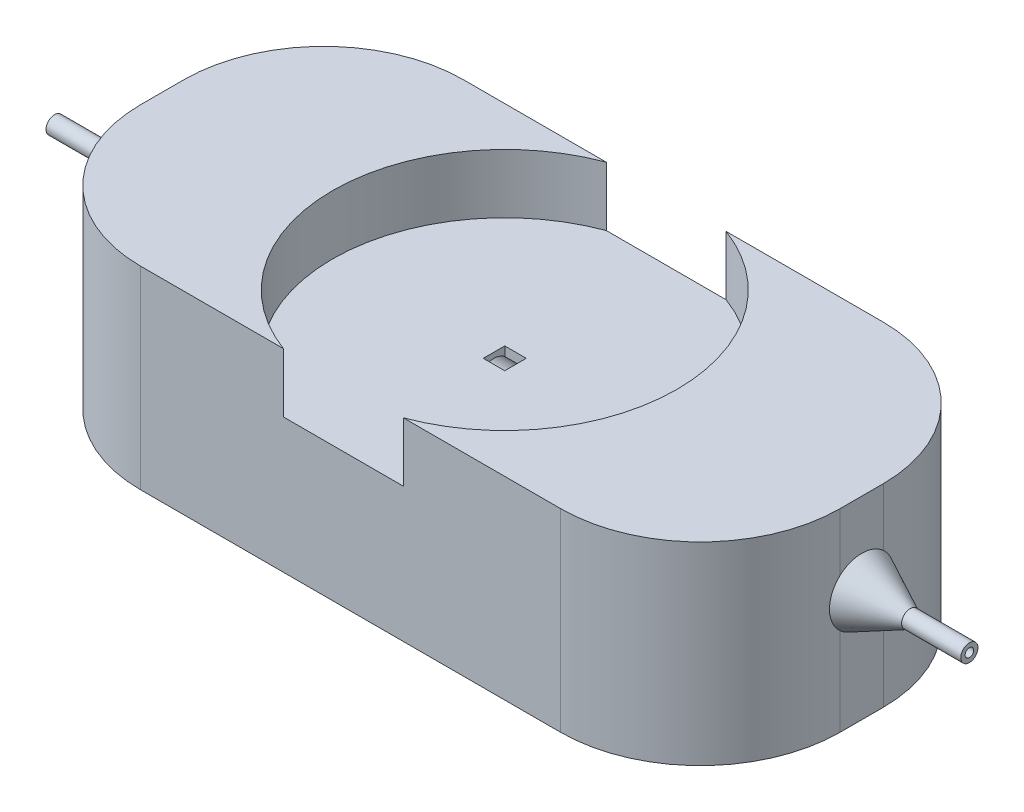
ISO-10303-21;
HEADER;
FILE_DESCRIPTION(('STEP AP214'),'2;1');
FILE_NAME('part.step','',(''),(''),'','','');
FILE_SCHEMA(('AUTOMOTIVE_DESIGN { 1 0 10303 214 1 1 1 1 }'));
ENDSEC;
DATA;
#1=APPLICATION_CONTEXT('core data for automotive mechanical design processes');
#2=APPLICATION_PROTOCOL_DEFINITION('international standard','automotive_design',2000,#1);
#3=PRODUCT_CONTEXT('',#1,'mechanical');
#4=PRODUCT('Part','Part','',(#3));
#5=PRODUCT_RELATED_PRODUCT_CATEGORY('part','',(#4));
#6=PRODUCT_DEFINITION_FORMATION('','',#4);
#7=PRODUCT_DEFINITION_CONTEXT('part definition',#1,'design');
#8=PRODUCT_DEFINITION('design','',#6,#7);
#9=PRODUCT_DEFINITION_SHAPE('','',#8);
#10=(LENGTH_UNIT() NAMED_UNIT(*) SI_UNIT(.MILLI.,.METRE.));
#11=(NAMED_UNIT(*) PLANE_ANGLE_UNIT() SI_UNIT($,.RADIAN.));
#12=(NAMED_UNIT(*) SI_UNIT($,.STERADIAN.) SOLID_ANGLE_UNIT());
#13=UNCERTAINTY_MEASURE_WITH_UNIT(LENGTH_MEASURE(1.E-05),#10,'distance_accuracy_value','');
#14=(GEOMETRIC_REPRESENTATION_CONTEXT(3) GLOBAL_UNCERTAINTY_ASSIGNED_CONTEXT((#13)) GLOBAL_UNIT_ASSIGNED_CONTEXT((#10,
#11,#12)) REPRESENTATION_CONTEXT('',''));
#15=CARTESIAN_POINT('',(0.,0.,0.));
#16=DIRECTION('',(0.,0.,1.));
#17=DIRECTION('',(1.,0.,0.));
#18=AXIS2_PLACEMENT_3D('',#15,#16,#17);
#19=CARTESIAN_POINT('',(40.,58.,15.));
#20=DIRECTION('',(-1.,0.,0.));
#21=DIRECTION('',(0.,0.,1.));
#22=AXIS2_PLACEMENT_3D('',#19,#20,#21);
#23=PLANE('',#22);
#24=DIRECTION('',(0.,-1.,0.));
#25=VECTOR('',#24,1.);
#26=CARTESIAN_POINT('',(40.,58.,2.00000000000001));
#27=LINE('',#26,#25);
#28=CARTESIAN_POINT('',(40.,58.,2.00000000000001));
#29=VERTEX_POINT('',#28);
#30=CARTESIAN_POINT('',(40.,52.6346340871573,2.00000000000001));
#31=VERTEX_POINT('',#30);
#32=EDGE_CURVE('E224',#29,#31,#27,.T.);
#33=ORIENTED_EDGE('',*,*,#32,.T.);
#34=CARTESIAN_POINT('',(40.,50.3985661096575,0.));
#35=DIRECTION('',(1.,0.,0.));
#36=DIRECTION('',(0.,0.,-1.));
#37=AXIS2_PLACEMENT_3D('',#34,#35,#36);
#38=CIRCLE('',#37,3.);
#39=CARTESIAN_POINT('',(40.,52.6346340871573,-2.));
#40=VERTEX_POINT('',#39);
#41=EDGE_CURVE('E65',#40,#31,#38,.T.);
#42=ORIENTED_EDGE('',*,*,#41,.F.);
#43=DIRECTION('',(0.,-1.,0.));
#44=VECTOR('',#43,1.);
#45=CARTESIAN_POINT('',(40.,58.,-2.));
#46=LINE('',#45,#44);
#47=CARTESIAN_POINT('',(40.,58.,-2.));
#48=VERTEX_POINT('',#47);
#49=EDGE_CURVE('E421',#40,#48,#46,.F.);
#50=ORIENTED_EDGE('',*,*,#49,.T.);
#51=DIRECTION('',(0.,0.,-1.));
#52=VECTOR('',#51,1.);
#53=CARTESIAN_POINT('',(40.,58.,15.));
#54=LINE('',#53,#52);
#55=EDGE_CURVE('E395',#29,#48,#54,.T.);
#56=ORIENTED_EDGE('',*,*,#55,.F.);
#57=EDGE_LOOP('',(#33,#42,#50,#56));
#58=FACE_BOUND('',#57,.T.);
#59=ADVANCED_FACE('F47',(#58),#23,.F.);
#60=CARTESIAN_POINT('',(-25.,58.,15.));
#61=DIRECTION('',(1.,0.,0.));
#62=DIRECTION('',(0.,0.,-1.));
#63=AXIS2_PLACEMENT_3D('',#60,#61,#62);
#64=PLANE('',#63);
#65=DIRECTION('',(0.,-1.,0.));
#66=VECTOR('',#65,1.);
#67=CARTESIAN_POINT('',(-25.,58.,-1.99999999999999));
#68=LINE('',#67,#66);
#69=CARTESIAN_POINT('',(-25.,58.,-1.99999999999999));
#70=VERTEX_POINT('',#69);
#71=CARTESIAN_POINT('',(-25.,52.6360679774998,-1.99999999999999));
#72=VERTEX_POINT('',#71);
#73=EDGE_CURVE('E442',#70,#72,#68,.T.);
#74=ORIENTED_EDGE('',*,*,#73,.T.);
#75=CARTESIAN_POINT('',(-25.,50.4,0.));
#76=DIRECTION('',(1.,0.,0.));
#77=DIRECTION('',(0.,0.,-1.));
#78=AXIS2_PLACEMENT_3D('',#75,#76,#77);
#79=CIRCLE('',#78,3.);
#80=CARTESIAN_POINT('',(-25.,52.6360679774998,2.00000000000001));
#81=VERTEX_POINT('',#80);
#82=EDGE_CURVE('E279',#72,#81,#79,.T.);
#83=ORIENTED_EDGE('',*,*,#82,.T.);
#84=DIRECTION('',(0.,-1.,0.));
#85=VECTOR('',#84,1.);
#86=CARTESIAN_POINT('',(-25.,58.,2.00000000000001));
#87=LINE('',#86,#85);
#88=CARTESIAN_POINT('',(-25.,58.,2.00000000000001));
#89=VERTEX_POINT('',#88);
#90=EDGE_CURVE('E436',#81,#89,#87,.F.);
#91=ORIENTED_EDGE('',*,*,#90,.T.);
#92=DIRECTION('',(0.,0.,1.));
#93=VECTOR('',#92,1.);
#94=CARTESIAN_POINT('',(-25.,58.,15.));
#95=LINE('',#94,#93);
#96=EDGE_CURVE('E404',#70,#89,#95,.T.);
#97=ORIENTED_EDGE('',*,*,#96,.F.);
#98=EDGE_LOOP('',(#74,#83,#91,#97));
#99=FACE_BOUND('',#98,.T.);
#100=ADVANCED_FACE('F519',(#99),#64,.F.);
#101=CARTESIAN_POINT('',(0.,58.,0.));
#102=DIRECTION('',(0.,-1.,0.));
#103=DIRECTION('',(0.,0.,-1.));
#104=AXIS2_PLACEMENT_3D('',#101,#102,#103);
#105=PLANE('',#104);
#106=DIRECTION('',(-1.,0.,0.));
#107=VECTOR('',#106,1.);
#108=CARTESIAN_POINT('',(-25.,58.,-15.));
#109=LINE('',#108,#107);
#110=CARTESIAN_POINT('',(27.,58.,-15.));
#111=VERTEX_POINT('',#110);
#112=CARTESIAN_POINT('',(12.3962726493241,58.,-15.));
#113=VERTEX_POINT('',#112);
#114=EDGE_CURVE('E400',#111,#113,#109,.T.);
#115=ORIENTED_EDGE('',*,*,#114,.T.);
#116=CARTESIAN_POINT('',(6.82850828649366,58.,-1.6826817716975E-13));
#117=DIRECTION('',(0.,1.,0.));
#118=DIRECTION('',(0.,0.,1.));
#119=AXIS2_PLACEMENT_3D('',#116,#117,#118);
#120=CIRCLE('',#119,16.);
#121=CARTESIAN_POINT('',(12.3962726493232,58.,15.));
#122=VERTEX_POINT('',#121);
#123=EDGE_CURVE('E331',#122,#113,#120,.T.);
#124=ORIENTED_EDGE('',*,*,#123,.F.);
#125=DIRECTION('',(1.,0.,0.));
#126=VECTOR('',#125,1.);
#127=CARTESIAN_POINT('',(-25.,58.,15.));
#128=LINE('',#127,#126);
#129=CARTESIAN_POINT('',(27.,58.,15.));
#130=VERTEX_POINT('',#129);
#131=EDGE_CURVE('E408',#122,#130,#128,.T.);
#132=ORIENTED_EDGE('',*,*,#131,.T.);
#133=CARTESIAN_POINT('',(27.,58.,2.00000000000001));
#134=DIRECTION('',(0.,-1.,0.));
#135=DIRECTION('',(0.,0.,-1.));
#136=AXIS2_PLACEMENT_3D('',#133,#134,#135);
#137=CIRCLE('',#136,13.);
#138=EDGE_CURVE('E427',#130,#29,#137,.F.);
#139=ORIENTED_EDGE('',*,*,#138,.T.);
#140=ORIENTED_EDGE('',*,*,#55,.T.);
#141=CARTESIAN_POINT('',(27.,58.,-2.));
#142=DIRECTION('',(0.,-1.,0.));
#143=DIRECTION('',(0.,0.,-1.));
#144=AXIS2_PLACEMENT_3D('',#141,#142,#143);
#145=CIRCLE('',#144,13.);
#146=EDGE_CURVE('E433',#48,#111,#145,.F.);
#147=ORIENTED_EDGE('',*,*,#146,.T.);
#148=EDGE_LOOP('',(#115,#124,#132,#139,#140,#147));
#149=FACE_BOUND('',#148,.T.);
#150=ADVANCED_FACE('F526',(#149),#105,.F.);
#151=CARTESIAN_POINT('',(40.,40.,-2.));
#152=VERTEX_POINT('',#151);
#153=CARTESIAN_POINT('',(40.,48.1624981321577,-2.));
#154=VERTEX_POINT('',#153);
#155=EDGE_CURVE('E230',#152,#154,#46,.F.);
#156=ORIENTED_EDGE('',*,*,#155,.T.);
#157=CARTESIAN_POINT('',(40.,48.1624981321577,2.00000000000001));
#158=VERTEX_POINT('',#157);
#159=EDGE_CURVE('E228',#158,#154,#38,.T.);
#160=ORIENTED_EDGE('',*,*,#159,.F.);
#161=CARTESIAN_POINT('',(40.,40.,2.00000000000001));
#162=VERTEX_POINT('',#161);
#163=EDGE_CURVE('E212',#158,#162,#27,.T.);
#164=ORIENTED_EDGE('',*,*,#163,.T.);
#165=DIRECTION('',(0.,0.,1.));
#166=VECTOR('',#165,1.);
#167=CARTESIAN_POINT('',(40.,40.,15.));
#168=LINE('',#167,#166);
#169=EDGE_CURVE('E388',#152,#162,#168,.T.);
#170=ORIENTED_EDGE('',*,*,#169,.F.);
#171=EDGE_LOOP('',(#156,#160,#164,#170));
#172=FACE_BOUND('',#171,.T.);
#173=ADVANCED_FACE('F229',(#172),#23,.F.);
#174=CARTESIAN_POINT('',(-25.,58.,-15.));
#175=DIRECTION('',(0.,0.,1.));
#176=DIRECTION('',(1.,0.,0.));
#177=AXIS2_PLACEMENT_3D('',#174,#175,#176);
#178=PLANE('',#177);
#179=DIRECTION('',(-1.,0.,0.));
#180=VECTOR('',#179,1.);
#181=CARTESIAN_POINT('',(-25.,52.5,-15.));
#182=LINE('',#181,#180);
#183=CARTESIAN_POINT('',(12.3962726493241,52.5,-15.));
#184=VERTEX_POINT('',#183);
#185=CARTESIAN_POINT('',(1.26074392366317,52.5,-15.));
#186=VERTEX_POINT('',#185);
#187=EDGE_CURVE('E369',#184,#186,#182,.T.);
#188=ORIENTED_EDGE('',*,*,#187,.F.);
#189=DIRECTION('',(0.,1.,0.));
#190=VECTOR('',#189,1.);
#191=CARTESIAN_POINT('',(12.3962726493241,52.5,-15.));
#192=LINE('',#191,#190);
#193=EDGE_CURVE('E365',#184,#113,#192,.T.);
#194=ORIENTED_EDGE('',*,*,#193,.T.);
#195=ORIENTED_EDGE('',*,*,#114,.F.);
#196=DIRECTION('',(0.,-1.,0.));
#197=VECTOR('',#196,1.);
#198=CARTESIAN_POINT('',(27.,58.,-15.));
#199=LINE('',#198,#197);
#200=CARTESIAN_POINT('',(27.,40.,-15.));
#201=VERTEX_POINT('',#200);
#202=EDGE_CURVE('E225',#111,#201,#199,.T.);
#203=ORIENTED_EDGE('',*,*,#202,.T.);
#204=DIRECTION('',(1.,0.,0.));
#205=VECTOR('',#204,1.);
#206=CARTESIAN_POINT('',(-25.,40.,-15.));
#207=LINE('',#206,#205);
#208=CARTESIAN_POINT('',(-12.,40.,-15.));
#209=VERTEX_POINT('',#208);
#210=EDGE_CURVE('E385',#209,#201,#207,.T.);
#211=ORIENTED_EDGE('',*,*,#210,.F.);
#212=DIRECTION('',(0.,-1.,0.));
#213=VECTOR('',#212,1.);
#214=CARTESIAN_POINT('',(-12.,58.,-15.));
#215=LINE('',#214,#213);
#216=CARTESIAN_POINT('',(-12.,58.,-15.));
#217=VERTEX_POINT('',#216);
#218=EDGE_CURVE('E413',#209,#217,#215,.F.);
#219=ORIENTED_EDGE('',*,*,#218,.T.);
#220=CARTESIAN_POINT('',(1.26074392366317,58.,-15.));
#221=VERTEX_POINT('',#220);
#222=EDGE_CURVE('E399',#221,#217,#109,.T.);
#223=ORIENTED_EDGE('',*,*,#222,.F.);
#224=DIRECTION('',(0.,1.,0.));
#225=VECTOR('',#224,1.);
#226=CARTESIAN_POINT('',(1.26074392366316,52.5,-15.));
#227=LINE('',#226,#225);
#228=EDGE_CURVE('E361',#221,#186,#227,.F.);
#229=ORIENTED_EDGE('',*,*,#228,.T.);
#230=EDGE_LOOP('',(#188,#194,#195,#203,#211,#219,#223,#229));
#231=FACE_BOUND('',#230,.T.);
#232=ADVANCED_FACE('F532',(#231),#178,.F.);
#233=CARTESIAN_POINT('',(-25.,40.,2.00000000000001));
#234=VERTEX_POINT('',#233);
#235=CARTESIAN_POINT('',(-25.,48.1639320225002,2.00000000000001));
#236=VERTEX_POINT('',#235);
#237=EDGE_CURVE('E437',#234,#236,#87,.F.);
#238=ORIENTED_EDGE('',*,*,#237,.T.);
#239=CARTESIAN_POINT('',(-25.,48.1639320225002,-1.99999999999999));
#240=VERTEX_POINT('',#239);
#241=EDGE_CURVE('E571',#236,#240,#79,.T.);
#242=ORIENTED_EDGE('',*,*,#241,.T.);
#243=CARTESIAN_POINT('',(-25.,40.,-1.99999999999999));
#244=VERTEX_POINT('',#243);
#245=EDGE_CURVE('E441',#240,#244,#68,.T.);
#246=ORIENTED_EDGE('',*,*,#245,.T.);
#247=DIRECTION('',(0.,0.,-1.));
#248=VECTOR('',#247,1.);
#249=CARTESIAN_POINT('',(-25.,40.,15.));
#250=LINE('',#249,#248);
#251=EDGE_CURVE('E375',#234,#244,#250,.T.);
#252=ORIENTED_EDGE('',*,*,#251,.F.);
#253=EDGE_LOOP('',(#238,#242,#246,#252));
#254=FACE_BOUND('',#253,.T.);
#255=ADVANCED_FACE('F529',(#254),#64,.F.);
#256=CARTESIAN_POINT('',(-25.,58.,15.));
#257=DIRECTION('',(0.,0.,-1.));
#258=DIRECTION('',(-1.,0.,0.));
#259=AXIS2_PLACEMENT_3D('',#256,#257,#258);
#260=PLANE('',#259);
#261=DIRECTION('',(1.,0.,0.));
#262=VECTOR('',#261,1.);
#263=CARTESIAN_POINT('',(-25.,52.5,15.));
#264=LINE('',#263,#262);
#265=CARTESIAN_POINT('',(1.2607439236641,52.5,15.));
#266=VERTEX_POINT('',#265);
#267=CARTESIAN_POINT('',(12.3962726493232,52.5,15.));
#268=VERTEX_POINT('',#267);
#269=EDGE_CURVE('E462',#266,#268,#264,.T.);
#270=ORIENTED_EDGE('',*,*,#269,.F.);
#271=DIRECTION('',(0.,1.,0.));
#272=VECTOR('',#271,1.);
#273=CARTESIAN_POINT('',(1.26074392366409,52.5,15.));
#274=LINE('',#273,#272);
#275=CARTESIAN_POINT('',(1.2607439236641,58.,15.));
#276=VERTEX_POINT('',#275);
#277=EDGE_CURVE('E357',#266,#276,#274,.T.);
#278=ORIENTED_EDGE('',*,*,#277,.T.);
#279=CARTESIAN_POINT('',(-12.,58.,15.));
#280=VERTEX_POINT('',#279);
#281=EDGE_CURVE('E409',#280,#276,#128,.T.);
#282=ORIENTED_EDGE('',*,*,#281,.F.);
#283=DIRECTION('',(0.,-1.,0.));
#284=VECTOR('',#283,1.);
#285=CARTESIAN_POINT('',(-12.,58.,15.));
#286=LINE('',#285,#284);
#287=CARTESIAN_POINT('',(-12.,40.,15.));
#288=VERTEX_POINT('',#287);
#289=EDGE_CURVE('E446',#280,#288,#286,.T.);
#290=ORIENTED_EDGE('',*,*,#289,.T.);
#291=DIRECTION('',(-1.,0.,0.));
#292=VECTOR('',#291,1.);
#293=CARTESIAN_POINT('',(-25.,40.,15.));
#294=LINE('',#293,#292);
#295=CARTESIAN_POINT('',(27.,40.,15.));
#296=VERTEX_POINT('',#295);
#297=EDGE_CURVE('E372',#296,#288,#294,.T.);
#298=ORIENTED_EDGE('',*,*,#297,.F.);
#299=DIRECTION('',(0.,-1.,0.));
#300=VECTOR('',#299,1.);
#301=CARTESIAN_POINT('',(27.,58.,15.));
#302=LINE('',#301,#300);
#303=EDGE_CURVE('E450',#296,#130,#302,.F.);
#304=ORIENTED_EDGE('',*,*,#303,.T.);
#305=ORIENTED_EDGE('',*,*,#131,.F.);
#306=DIRECTION('',(0.,1.,0.));
#307=VECTOR('',#306,1.);
#308=CARTESIAN_POINT('',(12.3962726493232,52.5,15.));
#309=LINE('',#308,#307);
#310=EDGE_CURVE('E350',#122,#268,#309,.F.);
#311=ORIENTED_EDGE('',*,*,#310,.T.);
#312=EDGE_LOOP('',(#270,#278,#282,#290,#298,#304,#305,#311));
#313=FACE_BOUND('',#312,.T.);
#314=ADVANCED_FACE('F564',(#313),#260,.F.);
#315=CARTESIAN_POINT('',(27.,58.,-2.));
#316=DIRECTION('',(0.,-1.,0.));
#317=DIRECTION('',(0.,0.,-1.));
#318=AXIS2_PLACEMENT_3D('',#315,#316,#317);
#319=CYLINDRICAL_SURFACE('',#318,13.);
#320=ORIENTED_EDGE('',*,*,#155,.F.);
#321=CARTESIAN_POINT('',(27.,40.,-2.));
#322=DIRECTION('',(0.,-1.,0.));
#323=DIRECTION('',(0.,0.,-1.));
#324=AXIS2_PLACEMENT_3D('',#321,#322,#323);
#325=CIRCLE('',#324,13.);
#326=EDGE_CURVE('E391',#152,#201,#325,.F.);
#327=ORIENTED_EDGE('',*,*,#326,.T.);
#328=ORIENTED_EDGE('',*,*,#202,.F.);
#329=ORIENTED_EDGE('',*,*,#146,.F.);
#330=ORIENTED_EDGE('',*,*,#49,.F.);
#331=DIRECTION('',(0.,-1.,0.));
#332=VECTOR('',#331,1.);
#333=CARTESIAN_POINT('',(40.,58.,-2.));
#334=LINE('',#333,#332);
#335=EDGE_CURVE('E72',#154,#40,#334,.F.);
#336=ORIENTED_EDGE('',*,*,#335,.F.);
#337=EDGE_LOOP('',(#320,#327,#328,#329,#330,#336));
#338=FACE_BOUND('',#337,.T.);
#339=ADVANCED_FACE('F784',(#338),#319,.T.);
#340=CARTESIAN_POINT('',(-12.,58.,-1.99999999999999));
#341=DIRECTION('',(0.,-1.,0.));
#342=DIRECTION('',(0.,0.,-1.));
#343=AXIS2_PLACEMENT_3D('',#340,#341,#342);
#344=CYLINDRICAL_SURFACE('',#343,13.);
#345=ORIENTED_EDGE('',*,*,#218,.F.);
#346=CARTESIAN_POINT('',(-12.,40.,-1.99999999999999));
#347=DIRECTION('',(0.,-1.,0.));
#348=DIRECTION('',(0.,0.,-1.));
#349=AXIS2_PLACEMENT_3D('',#346,#347,#348);
#350=CIRCLE('',#349,13.);
#351=EDGE_CURVE('E381',#209,#244,#350,.F.);
#352=ORIENTED_EDGE('',*,*,#351,.T.);
#353=ORIENTED_EDGE('',*,*,#245,.F.);
#354=DIRECTION('',(0.,-1.,0.));
#355=VECTOR('',#354,1.);
#356=CARTESIAN_POINT('',(-25.,58.,-1.99999999999999));
#357=LINE('',#356,#355);
#358=EDGE_CURVE('E292',#240,#72,#357,.F.);
#359=ORIENTED_EDGE('',*,*,#358,.T.);
#360=ORIENTED_EDGE('',*,*,#73,.F.);
#361=CARTESIAN_POINT('',(-12.,58.,-1.99999999999999));
#362=DIRECTION('',(0.,-1.,0.));
#363=DIRECTION('',(0.,0.,-1.));
#364=AXIS2_PLACEMENT_3D('',#361,#362,#363);
#365=CIRCLE('',#364,13.);
#366=EDGE_CURVE('E430',#217,#70,#365,.F.);
#367=ORIENTED_EDGE('',*,*,#366,.F.);
#368=EDGE_LOOP('',(#345,#352,#353,#359,#360,#367));
#369=FACE_BOUND('',#368,.T.);
#370=ADVANCED_FACE('F783',(#369),#344,.T.);
#371=CARTESIAN_POINT('',(27.,58.,2.00000000000001));
#372=DIRECTION('',(0.,-1.,0.));
#373=DIRECTION('',(0.,0.,-1.));
#374=AXIS2_PLACEMENT_3D('',#371,#372,#373);
#375=CYLINDRICAL_SURFACE('',#374,13.);
#376=ORIENTED_EDGE('',*,*,#303,.F.);
#377=CARTESIAN_POINT('',(27.,40.,2.00000000000001));
#378=DIRECTION('',(0.,-1.,0.));
#379=DIRECTION('',(0.,0.,-1.));
#380=AXIS2_PLACEMENT_3D('',#377,#378,#379);
#381=CIRCLE('',#380,13.);
#382=EDGE_CURVE('E219',#296,#162,#381,.F.);
#383=ORIENTED_EDGE('',*,*,#382,.T.);
#384=ORIENTED_EDGE('',*,*,#163,.F.);
#385=DIRECTION('',(0.,-1.,0.));
#386=VECTOR('',#385,1.);
#387=CARTESIAN_POINT('',(40.,58.,2.00000000000001));
#388=LINE('',#387,#386);
#389=EDGE_CURVE('E218',#158,#31,#388,.F.);
#390=ORIENTED_EDGE('',*,*,#389,.T.);
#391=ORIENTED_EDGE('',*,*,#32,.F.);
#392=ORIENTED_EDGE('',*,*,#138,.F.);
#393=EDGE_LOOP('',(#376,#383,#384,#390,#391,#392));
#394=FACE_BOUND('',#393,.T.);
#395=ADVANCED_FACE('F215',(#394),#375,.T.);
#396=CARTESIAN_POINT('',(-12.,58.,2.00000000000001));
#397=DIRECTION('',(0.,-1.,0.));
#398=DIRECTION('',(0.,0.,-1.));
#399=AXIS2_PLACEMENT_3D('',#396,#397,#398);
#400=CYLINDRICAL_SURFACE('',#399,13.);
#401=ORIENTED_EDGE('',*,*,#237,.F.);
#402=CARTESIAN_POINT('',(-12.,40.,2.00000000000001));
#403=DIRECTION('',(0.,-1.,0.));
#404=DIRECTION('',(0.,0.,-1.));
#405=AXIS2_PLACEMENT_3D('',#402,#403,#404);
#406=CIRCLE('',#405,13.);
#407=EDGE_CURVE('E454',#234,#288,#406,.F.);
#408=ORIENTED_EDGE('',*,*,#407,.T.);
#409=ORIENTED_EDGE('',*,*,#289,.F.);
#410=CARTESIAN_POINT('',(-12.,58.,2.00000000000001));
#411=DIRECTION('',(0.,-1.,0.));
#412=DIRECTION('',(0.,0.,-1.));
#413=AXIS2_PLACEMENT_3D('',#410,#411,#412);
#414=CIRCLE('',#413,13.);
#415=EDGE_CURVE('E424',#89,#280,#414,.F.);
#416=ORIENTED_EDGE('',*,*,#415,.F.);
#417=ORIENTED_EDGE('',*,*,#90,.F.);
#418=DIRECTION('',(0.,-1.,0.));
#419=VECTOR('',#418,1.);
#420=CARTESIAN_POINT('',(-25.,58.,2.00000000000001));
#421=LINE('',#420,#419);
#422=EDGE_CURVE('E288',#236,#81,#421,.F.);
#423=ORIENTED_EDGE('',*,*,#422,.F.);
#424=EDGE_LOOP('',(#401,#408,#409,#416,#417,#423));
#425=FACE_BOUND('',#424,.T.);
#426=ADVANCED_FACE('F49',(#425),#400,.T.);
#427=ORIENTED_EDGE('',*,*,#281,.T.);
#428=CARTESIAN_POINT('',(6.82850828649366,58.,-1.6826817716975E-13));
#429=DIRECTION('',(0.,-1.,0.));
#430=DIRECTION('',(0.,0.,-1.));
#431=AXIS2_PLACEMENT_3D('',#428,#429,#430);
#432=CIRCLE('',#431,16.);
#433=EDGE_CURVE('E458',#276,#221,#432,.T.);
#434=ORIENTED_EDGE('',*,*,#433,.T.);
#435=ORIENTED_EDGE('',*,*,#222,.T.);
#436=ORIENTED_EDGE('',*,*,#366,.T.);
#437=ORIENTED_EDGE('',*,*,#96,.T.);
#438=ORIENTED_EDGE('',*,*,#415,.T.);
#439=EDGE_LOOP('',(#427,#434,#435,#436,#437,#438));
#440=FACE_BOUND('',#439,.T.);
#441=ADVANCED_FACE('F541',(#440),#105,.F.);
#442=CARTESIAN_POINT('',(0.,40.,0.));
#443=DIRECTION('',(0.,-1.,0.));
#444=DIRECTION('',(0.,0.,-1.));
#445=AXIS2_PLACEMENT_3D('',#442,#443,#444);
#446=PLANE('',#445);
#447=ORIENTED_EDGE('',*,*,#169,.T.);
#448=ORIENTED_EDGE('',*,*,#382,.F.);
#449=ORIENTED_EDGE('',*,*,#297,.T.);
#450=ORIENTED_EDGE('',*,*,#407,.F.);
#451=ORIENTED_EDGE('',*,*,#251,.T.);
#452=ORIENTED_EDGE('',*,*,#351,.F.);
#453=ORIENTED_EDGE('',*,*,#210,.T.);
#454=ORIENTED_EDGE('',*,*,#326,.F.);
#455=EDGE_LOOP('',(#447,#448,#449,#450,#451,#452,#453,#454));
#456=FACE_BOUND('',#455,.T.);
#457=ADVANCED_FACE('F548',(#456),#446,.T.);
#458=CARTESIAN_POINT('',(6.82850828649366,52.5,-1.6826817716975E-13));
#459=DIRECTION('',(0.,1.,0.));
#460=DIRECTION('',(0.,0.,1.));
#461=AXIS2_PLACEMENT_3D('',#458,#459,#460);
#462=PLANE('',#461);
#463=DIRECTION('',(0.,0.,-1.));
#464=VECTOR('',#463,1.);
#465=CARTESIAN_POINT('',(7.82850828649366,52.5,0.999999999999832));
#466=LINE('',#465,#464);
#467=CARTESIAN_POINT('',(7.82850828649366,52.5,0.999999999999832));
#468=VERTEX_POINT('',#467);
#469=CARTESIAN_POINT('',(7.82850828649366,52.5,-1.00000000000017));
#470=VERTEX_POINT('',#469);
#471=EDGE_CURVE('E295',#468,#470,#466,.T.);
#472=ORIENTED_EDGE('',*,*,#471,.F.);
#473=DIRECTION('',(1.,0.,0.));
#474=VECTOR('',#473,1.);
#475=CARTESIAN_POINT('',(5.82850828649366,52.5,0.999999999999832));
#476=LINE('',#475,#474);
#477=CARTESIAN_POINT('',(5.82850828649366,52.5,0.999999999999832));
#478=VERTEX_POINT('',#477);
#479=EDGE_CURVE('E301',#478,#468,#476,.T.);
#480=ORIENTED_EDGE('',*,*,#479,.F.);
#481=DIRECTION('',(0.,0.,1.));
#482=VECTOR('',#481,1.);
#483=CARTESIAN_POINT('',(5.82850828649366,52.5,0.999999999999832));
#484=LINE('',#483,#482);
#485=CARTESIAN_POINT('',(5.82850828649366,52.5,-1.00000000000017));
#486=VERTEX_POINT('',#485);
#487=EDGE_CURVE('E320',#486,#478,#484,.T.);
#488=ORIENTED_EDGE('',*,*,#487,.F.);
#489=DIRECTION('',(-1.,0.,0.));
#490=VECTOR('',#489,1.);
#491=CARTESIAN_POINT('',(5.82850828649366,52.5,-1.00000000000017));
#492=LINE('',#491,#490);
#493=EDGE_CURVE('E316',#470,#486,#492,.T.);
#494=ORIENTED_EDGE('',*,*,#493,.F.);
#495=EDGE_LOOP('',(#472,#480,#488,#494));
#496=FACE_BOUND('',#495,.T.);
#497=ORIENTED_EDGE('',*,*,#187,.T.);
#498=CARTESIAN_POINT('',(6.82850828649366,52.5,-1.6826817716975E-13));
#499=DIRECTION('',(0.,1.,0.));
#500=DIRECTION('',(0.,0.,1.));
#501=AXIS2_PLACEMENT_3D('',#498,#499,#500);
#502=CIRCLE('',#501,16.);
#503=EDGE_CURVE('E351',#186,#266,#502,.T.);
#504=ORIENTED_EDGE('',*,*,#503,.T.);
#505=ORIENTED_EDGE('',*,*,#269,.T.);
#506=EDGE_CURVE('E346',#268,#184,#502,.T.);
#507=ORIENTED_EDGE('',*,*,#506,.T.);
#508=EDGE_LOOP('',(#497,#504,#505,#507));
#509=FACE_BOUND('',#508,.T.);
#510=ADVANCED_FACE('F554',(#496,#509),#462,.T.);
#511=CARTESIAN_POINT('',(6.82850828649366,52.5,-1.6826817716975E-13));
#512=DIRECTION('',(0.,1.,0.));
#513=DIRECTION('',(0.,0.,1.));
#514=AXIS2_PLACEMENT_3D('',#511,#512,#513);
#515=CYLINDRICAL_SURFACE('',#514,16.);
#516=ORIENTED_EDGE('',*,*,#506,.F.);
#517=ORIENTED_EDGE('',*,*,#310,.F.);
#518=ORIENTED_EDGE('',*,*,#123,.T.);
#519=ORIENTED_EDGE('',*,*,#193,.F.);
#520=EDGE_LOOP('',(#516,#517,#518,#519));
#521=FACE_BOUND('',#520,.T.);
#522=ADVANCED_FACE('F762',(#521),#515,.F.);
#523=ORIENTED_EDGE('',*,*,#433,.F.);
#524=ORIENTED_EDGE('',*,*,#277,.F.);
#525=ORIENTED_EDGE('',*,*,#503,.F.);
#526=ORIENTED_EDGE('',*,*,#228,.F.);
#527=EDGE_LOOP('',(#523,#524,#525,#526));
#528=FACE_BOUND('',#527,.T.);
#529=ADVANCED_FACE('F756',(#528),#515,.F.);
#530=CARTESIAN_POINT('',(40.001,50.4,0.));
#531=DIRECTION('',(-1.,0.,0.));
#532=DIRECTION('',(0.,0.,1.));
#533=AXIS2_PLACEMENT_3D('',#530,#531,#532);
#534=CYLINDRICAL_SURFACE('',#533,1.6);
#535=DIRECTION('',(-1.,0.,0.));
#536=VECTOR('',#535,1.);
#537=CARTESIAN_POINT('',(40.001,49.1510004003205,-1.00000000000017));
#538=LINE('',#537,#536);
#539=CARTESIAN_POINT('',(5.82850828649366,49.1510004003205,-1.00000000000017));
#540=VERTEX_POINT('',#539);
#541=CARTESIAN_POINT('',(7.82850828649365,49.1510004003205,-1.00000000000017));
#542=VERTEX_POINT('',#541);
#543=EDGE_CURVE('E479',#540,#542,#538,.F.);
#544=ORIENTED_EDGE('',*,*,#543,.T.);
#545=CARTESIAN_POINT('',(7.82850828649365,50.4,0.));
#546=DIRECTION('',(1.,0.,0.));
#547=DIRECTION('',(0.,0.,-1.));
#548=AXIS2_PLACEMENT_3D('',#545,#546,#547);
#549=CIRCLE('',#548,1.6);
#550=CARTESIAN_POINT('',(7.82850828649366,49.1510004003202,0.999999999999832));
#551=VERTEX_POINT('',#550);
#552=EDGE_CURVE('E11',#542,#551,#549,.F.);
#553=ORIENTED_EDGE('',*,*,#552,.T.);
#554=DIRECTION('',(-1.,0.,0.));
#555=VECTOR('',#554,1.);
#556=CARTESIAN_POINT('',(40.001,49.1510004003202,0.999999999999832));
#557=LINE('',#556,#555);
#558=CARTESIAN_POINT('',(5.82850828649366,49.1510004003202,0.999999999999832));
#559=VERTEX_POINT('',#558);
#560=EDGE_CURVE('E51',#551,#559,#557,.T.);
#561=ORIENTED_EDGE('',*,*,#560,.T.);
#562=CARTESIAN_POINT('',(5.82850828649366,50.4,0.));
#563=DIRECTION('',(-1.,0.,0.));
#564=DIRECTION('',(0.,0.,1.));
#565=AXIS2_PLACEMENT_3D('',#562,#563,#564);
#566=CIRCLE('',#565,1.6);
#567=EDGE_CURVE('E474',#559,#540,#566,.F.);
#568=ORIENTED_EDGE('',*,*,#567,.T.);
#569=EDGE_LOOP('',(#544,#553,#561,#568));
#570=FACE_BOUND('',#569,.T.);
#571=DIRECTION('',(-1.,0.,0.));
#572=VECTOR('',#571,1.);
#573=CARTESIAN_POINT('',(40.001,51.6489995996798,0.999999999999832));
#574=LINE('',#573,#572);
#575=CARTESIAN_POINT('',(5.82850828649366,51.6489995996798,0.999999999999832));
#576=VERTEX_POINT('',#575);
#577=CARTESIAN_POINT('',(7.82850828649366,51.6489995996798,0.999999999999832));
#578=VERTEX_POINT('',#577);
#579=EDGE_CURVE('E473',#576,#578,#574,.F.);
#580=ORIENTED_EDGE('',*,*,#579,.T.);
#581=CARTESIAN_POINT('',(7.82850828649366,51.6489995996795,-1.00000000000017));
#582=VERTEX_POINT('',#581);
#583=EDGE_CURVE('E58',#578,#582,#549,.F.);
#584=ORIENTED_EDGE('',*,*,#583,.T.);
#585=DIRECTION('',(-1.,0.,0.));
#586=VECTOR('',#585,1.);
#587=CARTESIAN_POINT('',(40.001,51.6489995996795,-1.00000000000017));
#588=LINE('',#587,#586);
#589=CARTESIAN_POINT('',(5.82850828649366,51.6489995996795,-1.00000000000017));
#590=VERTEX_POINT('',#589);
#591=EDGE_CURVE('E465',#582,#590,#588,.T.);
#592=ORIENTED_EDGE('',*,*,#591,.T.);
#593=EDGE_CURVE('E469',#590,#576,#566,.F.);
#594=ORIENTED_EDGE('',*,*,#593,.T.);
#595=EDGE_LOOP('',(#580,#584,#592,#594));
#596=FACE_BOUND('',#595,.T.);
#597=CARTESIAN_POINT('',(-25.,50.4,0.));
#598=DIRECTION('',(1.,0.,0.));
#599=DIRECTION('',(0.,0.,-1.));
#600=AXIS2_PLACEMENT_3D('',#597,#598,#599);
#601=CIRCLE('',#600,1.6);
#602=CARTESIAN_POINT('',(-25.,50.4,-1.6));
#603=VERTEX_POINT('',#602);
#604=EDGE_CURVE('E283',#603,#603,#601,.F.);
#605=ORIENTED_EDGE('',*,*,#604,.T.);
#606=EDGE_LOOP('',(#605));
#607=FACE_BOUND('',#606,.T.);
#608=CARTESIAN_POINT('',(40.,50.4,0.));
#609=DIRECTION('',(-1.,0.,0.));
#610=DIRECTION('',(0.,0.,1.));
#611=AXIS2_PLACEMENT_3D('',#608,#609,#610);
#612=CIRCLE('',#611,1.6);
#613=CARTESIAN_POINT('',(40.,50.4,1.6));
#614=VERTEX_POINT('',#613);
#615=EDGE_CURVE('E243',#614,#614,#612,.F.);
#616=ORIENTED_EDGE('',*,*,#615,.T.);
#617=EDGE_LOOP('',(#616));
#618=FACE_BOUND('',#617,.T.);
#619=ADVANCED_FACE('F487',(#570,#596,#607,#618),#534,.F.);
#620=CARTESIAN_POINT('',(5.82850828649366,44.5,-1.00000000000017));
#621=DIRECTION('',(0.,0.,-1.));
#622=DIRECTION('',(-1.,0.,0.));
#623=AXIS2_PLACEMENT_3D('',#620,#621,#622);
#624=PLANE('',#623);
#625=DIRECTION('',(0.,1.,0.));
#626=VECTOR('',#625,1.);
#627=CARTESIAN_POINT('',(7.82850828649366,44.5,-1.00000000000017));
#628=LINE('',#627,#626);
#629=EDGE_CURVE('E313',#582,#470,#628,.T.);
#630=ORIENTED_EDGE('',*,*,#629,.T.);
#631=ORIENTED_EDGE('',*,*,#493,.T.);
#632=DIRECTION('',(0.,1.,0.));
#633=VECTOR('',#632,1.);
#634=CARTESIAN_POINT('',(5.82850828649366,44.5,-1.00000000000017));
#635=LINE('',#634,#633);
#636=EDGE_CURVE('E342',#590,#486,#635,.T.);
#637=ORIENTED_EDGE('',*,*,#636,.F.);
#638=ORIENTED_EDGE('',*,*,#591,.F.);
#639=EDGE_LOOP('',(#630,#631,#637,#638));
#640=FACE_BOUND('',#639,.T.);
#641=ADVANCED_FACE('F506',(#640),#624,.F.);
#642=CARTESIAN_POINT('',(5.82850828649366,44.5,0.999999999999832));
#643=DIRECTION('',(-1.,0.,0.));
#644=DIRECTION('',(0.,0.,1.));
#645=AXIS2_PLACEMENT_3D('',#642,#643,#644);
#646=PLANE('',#645);
#647=ORIENTED_EDGE('',*,*,#636,.T.);
#648=ORIENTED_EDGE('',*,*,#487,.T.);
#649=DIRECTION('',(0.,1.,0.));
#650=VECTOR('',#649,1.);
#651=CARTESIAN_POINT('',(5.82850828649366,44.5,0.999999999999832));
#652=LINE('',#651,#650);
#653=EDGE_CURVE('E337',#576,#478,#652,.T.);
#654=ORIENTED_EDGE('',*,*,#653,.F.);
#655=ORIENTED_EDGE('',*,*,#593,.F.);
#656=EDGE_LOOP('',(#647,#648,#654,#655));
#657=FACE_BOUND('',#656,.T.);
#658=ADVANCED_FACE('F514',(#657),#646,.F.);
#659=CARTESIAN_POINT('',(5.82850828649366,44.5,0.999999999999832));
#660=DIRECTION('',(0.,0.,1.));
#661=DIRECTION('',(1.,0.,0.));
#662=AXIS2_PLACEMENT_3D('',#659,#660,#661);
#663=PLANE('',#662);
#664=ORIENTED_EDGE('',*,*,#653,.T.);
#665=ORIENTED_EDGE('',*,*,#479,.T.);
#666=DIRECTION('',(0.,1.,0.));
#667=VECTOR('',#666,1.);
#668=CARTESIAN_POINT('',(7.82850828649366,44.5,0.999999999999832));
#669=LINE('',#668,#667);
#670=EDGE_CURVE('E332',#578,#468,#669,.T.);
#671=ORIENTED_EDGE('',*,*,#670,.F.);
#672=ORIENTED_EDGE('',*,*,#579,.F.);
#673=EDGE_LOOP('',(#664,#665,#671,#672));
#674=FACE_BOUND('',#673,.T.);
#675=ADVANCED_FACE('F826',(#674),#663,.F.);
#676=CARTESIAN_POINT('',(7.82850828649366,44.5,0.999999999999832));
#677=DIRECTION('',(1.,0.,0.));
#678=DIRECTION('',(0.,0.,-1.));
#679=AXIS2_PLACEMENT_3D('',#676,#677,#678);
#680=PLANE('',#679);
#681=ORIENTED_EDGE('',*,*,#670,.T.);
#682=ORIENTED_EDGE('',*,*,#471,.T.);
#683=ORIENTED_EDGE('',*,*,#629,.F.);
#684=ORIENTED_EDGE('',*,*,#583,.F.);
#685=EDGE_LOOP('',(#681,#682,#683,#684));
#686=FACE_BOUND('',#685,.T.);
#687=ADVANCED_FACE('F834',(#686),#680,.F.);
#688=CARTESIAN_POINT('',(7.82850828649366,44.5,-1.00000000000017));
#689=VERTEX_POINT('',#688);
#690=EDGE_CURVE('E343',#689,#542,#628,.T.);
#691=ORIENTED_EDGE('',*,*,#690,.F.);
#692=DIRECTION('',(0.,0.,-1.));
#693=VECTOR('',#692,1.);
#694=CARTESIAN_POINT('',(7.82850828649366,44.5,0.999999999999832));
#695=LINE('',#694,#693);
#696=CARTESIAN_POINT('',(7.82850828649366,44.5,0.999999999999832));
#697=VERTEX_POINT('',#696);
#698=EDGE_CURVE('E296',#697,#689,#695,.T.);
#699=ORIENTED_EDGE('',*,*,#698,.F.);
#700=EDGE_CURVE('E327',#697,#551,#669,.T.);
#701=ORIENTED_EDGE('',*,*,#700,.T.);
#702=ORIENTED_EDGE('',*,*,#552,.F.);
#703=EDGE_LOOP('',(#691,#699,#701,#702));
#704=FACE_BOUND('',#703,.T.);
#705=ADVANCED_FACE('F495',(#704),#680,.F.);
#706=ORIENTED_EDGE('',*,*,#700,.F.);
#707=DIRECTION('',(1.,0.,0.));
#708=VECTOR('',#707,1.);
#709=CARTESIAN_POINT('',(5.82850828649366,44.5,0.999999999999832));
#710=LINE('',#709,#708);
#711=CARTESIAN_POINT('',(5.82850828649366,44.5,0.999999999999832));
#712=VERTEX_POINT('',#711);
#713=EDGE_CURVE('E309',#712,#697,#710,.T.);
#714=ORIENTED_EDGE('',*,*,#713,.F.);
#715=EDGE_CURVE('E333',#712,#559,#652,.T.);
#716=ORIENTED_EDGE('',*,*,#715,.T.);
#717=ORIENTED_EDGE('',*,*,#560,.F.);
#718=EDGE_LOOP('',(#706,#714,#716,#717));
#719=FACE_BOUND('',#718,.T.);
#720=ADVANCED_FACE('F491',(#719),#663,.F.);
#721=ORIENTED_EDGE('',*,*,#715,.F.);
#722=DIRECTION('',(0.,0.,1.));
#723=VECTOR('',#722,1.);
#724=CARTESIAN_POINT('',(5.82850828649366,44.5,0.999999999999832));
#725=LINE('',#724,#723);
#726=CARTESIAN_POINT('',(5.82850828649366,44.5,-1.00000000000017));
#727=VERTEX_POINT('',#726);
#728=EDGE_CURVE('E305',#727,#712,#725,.T.);
#729=ORIENTED_EDGE('',*,*,#728,.F.);
#730=EDGE_CURVE('E338',#727,#540,#635,.T.);
#731=ORIENTED_EDGE('',*,*,#730,.T.);
#732=ORIENTED_EDGE('',*,*,#567,.F.);
#733=EDGE_LOOP('',(#721,#729,#731,#732));
#734=FACE_BOUND('',#733,.T.);
#735=ADVANCED_FACE('F501',(#734),#646,.F.);
#736=ORIENTED_EDGE('',*,*,#730,.F.);
#737=DIRECTION('',(-1.,0.,0.));
#738=VECTOR('',#737,1.);
#739=CARTESIAN_POINT('',(5.82850828649366,44.5,-1.00000000000017));
#740=LINE('',#739,#738);
#741=EDGE_CURVE('E300',#689,#727,#740,.T.);
#742=ORIENTED_EDGE('',*,*,#741,.F.);
#743=ORIENTED_EDGE('',*,*,#690,.T.);
#744=ORIENTED_EDGE('',*,*,#543,.F.);
#745=EDGE_LOOP('',(#736,#742,#743,#744));
#746=FACE_BOUND('',#745,.T.);
#747=ADVANCED_FACE('F503',(#746),#624,.F.);
#748=CARTESIAN_POINT('',(0.,44.5,0.));
#749=DIRECTION('',(0.,-1.,0.));
#750=DIRECTION('',(0.,0.,-1.));
#751=AXIS2_PLACEMENT_3D('',#748,#749,#750);
#752=PLANE('',#751);
#753=ORIENTED_EDGE('',*,*,#698,.T.);
#754=ORIENTED_EDGE('',*,*,#741,.T.);
#755=ORIENTED_EDGE('',*,*,#728,.T.);
#756=ORIENTED_EDGE('',*,*,#713,.T.);
#757=EDGE_LOOP('',(#753,#754,#755,#756));
#758=FACE_BOUND('',#757,.T.);
#759=ADVANCED_FACE('F498',(#758),#752,.F.);
#760=CARTESIAN_POINT('',(-25.,50.8,0.));
#761=DIRECTION('',(1.,0.,0.));
#762=DIRECTION('',(0.,0.,-1.));
#763=AXIS2_PLACEMENT_3D('',#760,#761,#762);
#764=PLANE('',#763);
#765=ORIENTED_EDGE('',*,*,#358,.F.);
#766=EDGE_CURVE('E278',#240,#72,#79,.T.);
#767=ORIENTED_EDGE('',*,*,#766,.T.);
#768=EDGE_LOOP('',(#765,#767));
#769=FACE_BOUND('',#768,.T.);
#770=ADVANCED_FACE('F511',(#769),#764,.T.);
#771=CARTESIAN_POINT('',(-25.,50.4,0.));
#772=DIRECTION('',(1.,0.,0.));
#773=DIRECTION('',(0.,0.,-1.));
#774=AXIS2_PLACEMENT_3D('',#771,#772,#773);
#775=CIRCLE('',#774,0.399999999999998);
#776=CARTESIAN_POINT('',(-25.,50.4,-0.399999999999998));
#777=VERTEX_POINT('',#776);
#778=EDGE_CURVE('E262',#777,#777,#775,.T.);
#779=ORIENTED_EDGE('',*,*,#778,.F.);
#780=EDGE_LOOP('',(#779));
#781=FACE_BOUND('',#780,.T.);
#782=ORIENTED_EDGE('',*,*,#604,.F.);
#783=EDGE_LOOP('',(#782));
#784=FACE_BOUND('',#783,.T.);
#785=ADVANCED_FACE('F602',(#781,#784),#764,.T.);
#786=EDGE_CURVE('E284',#81,#236,#79,.T.);
#787=ORIENTED_EDGE('',*,*,#786,.T.);
#788=ORIENTED_EDGE('',*,*,#422,.T.);
#789=EDGE_LOOP('',(#787,#788));
#790=FACE_BOUND('',#789,.T.);
#791=ADVANCED_FACE('F600',(#790),#764,.T.);
#792=CARTESIAN_POINT('',(-25.,50.4,0.));
#793=DIRECTION('',(1.,0.,0.));
#794=DIRECTION('',(0.,0.,-1.));
#795=AXIS2_PLACEMENT_3D('',#792,#793,#794);
#796=CONICAL_SURFACE('',#795,3.,0.454719274820969);
#797=CARTESIAN_POINT('',(-29.5,50.4,0.));
#798=DIRECTION('',(1.,0.,0.));
#799=DIRECTION('',(0.,0.,-1.));
#800=AXIS2_PLACEMENT_3D('',#797,#798,#799);
#801=CIRCLE('',#800,0.800000000000002);
#802=CARTESIAN_POINT('',(-29.5,50.4,-0.800000000000002));
#803=VERTEX_POINT('',#802);
#804=EDGE_CURVE('E274',#803,#803,#801,.T.);
#805=ORIENTED_EDGE('',*,*,#804,.T.);
#806=EDGE_LOOP('',(#805));
#807=FACE_BOUND('',#806,.T.);
#808=ORIENTED_EDGE('',*,*,#82,.F.);
#809=ORIENTED_EDGE('',*,*,#766,.F.);
#810=ORIENTED_EDGE('',*,*,#241,.F.);
#811=ORIENTED_EDGE('',*,*,#786,.F.);
#812=EDGE_LOOP('',(#808,#809,#810,#811));
#813=FACE_BOUND('',#812,.T.);
#814=ADVANCED_FACE('F596',(#807,#813),#796,.T.);
#815=CARTESIAN_POINT('',(-25.,50.4,0.));
#816=DIRECTION('',(1.,0.,0.));
#817=DIRECTION('',(0.,0.,-1.));
#818=AXIS2_PLACEMENT_3D('',#815,#816,#817);
#819=CYLINDRICAL_SURFACE('',#818,0.800000000000002);
#820=CARTESIAN_POINT('',(-35.,50.4,0.));
#821=DIRECTION('',(1.,0.,0.));
#822=DIRECTION('',(0.,0.,-1.));
#823=AXIS2_PLACEMENT_3D('',#820,#821,#822);
#824=CIRCLE('',#823,0.800000000000002);
#825=CARTESIAN_POINT('',(-35.,50.4,-0.800000000000002));
#826=VERTEX_POINT('',#825);
#827=EDGE_CURVE('E270',#826,#826,#824,.T.);
#828=ORIENTED_EDGE('',*,*,#827,.T.);
#829=EDGE_LOOP('',(#828));
#830=FACE_BOUND('',#829,.T.);
#831=ORIENTED_EDGE('',*,*,#804,.F.);
#832=EDGE_LOOP('',(#831));
#833=FACE_BOUND('',#832,.T.);
#834=ADVANCED_FACE('F608',(#830,#833),#819,.T.);
#835=CARTESIAN_POINT('',(-35.,51.2,0.));
#836=DIRECTION('',(-1.,0.,0.));
#837=DIRECTION('',(0.,0.,1.));
#838=AXIS2_PLACEMENT_3D('',#835,#836,#837);
#839=PLANE('',#838);
#840=CARTESIAN_POINT('',(-35.,50.4,0.));
#841=DIRECTION('',(1.,0.,0.));
#842=DIRECTION('',(0.,0.,-1.));
#843=AXIS2_PLACEMENT_3D('',#840,#841,#842);
#844=CIRCLE('',#843,0.399999999999998);
#845=CARTESIAN_POINT('',(-35.,50.4,-0.399999999999998));
#846=VERTEX_POINT('',#845);
#847=EDGE_CURVE('E266',#846,#846,#844,.T.);
#848=ORIENTED_EDGE('',*,*,#847,.T.);
#849=EDGE_LOOP('',(#848));
#850=FACE_BOUND('',#849,.T.);
#851=ORIENTED_EDGE('',*,*,#827,.F.);
#852=EDGE_LOOP('',(#851));
#853=FACE_BOUND('',#852,.T.);
#854=ADVANCED_FACE('F644',(#850,#853),#839,.T.);
#855=CARTESIAN_POINT('',(-25.,50.4,0.));
#856=DIRECTION('',(1.,0.,0.));
#857=DIRECTION('',(0.,0.,-1.));
#858=AXIS2_PLACEMENT_3D('',#855,#856,#857);
#859=CYLINDRICAL_SURFACE('',#858,0.399999999999998);
#860=ORIENTED_EDGE('',*,*,#778,.T.);
#861=EDGE_LOOP('',(#860));
#862=FACE_BOUND('',#861,.T.);
#863=ORIENTED_EDGE('',*,*,#847,.F.);
#864=EDGE_LOOP('',(#863));
#865=FACE_BOUND('',#864,.T.);
#866=ADVANCED_FACE('F654',(#862,#865),#859,.F.);
#867=CARTESIAN_POINT('',(40.,50.7985661096575,0.));
#868=DIRECTION('',(-1.,0.,0.));
#869=DIRECTION('',(0.,0.,1.));
#870=AXIS2_PLACEMENT_3D('',#867,#868,#869);
#871=PLANE('',#870);
#872=ORIENTED_EDGE('',*,*,#389,.F.);
#873=EDGE_CURVE('E236',#31,#158,#38,.T.);
#874=ORIENTED_EDGE('',*,*,#873,.F.);
#875=EDGE_LOOP('',(#872,#874));
#876=FACE_BOUND('',#875,.T.);
#877=ADVANCED_FACE('F241',(#876),#871,.T.);
#878=CARTESIAN_POINT('',(40.,50.3985661096575,0.));
#879=DIRECTION('',(1.,0.,0.));
#880=DIRECTION('',(0.,0.,-1.));
#881=AXIS2_PLACEMENT_3D('',#878,#879,#880);
#882=CIRCLE('',#881,0.399999999999998);
#883=CARTESIAN_POINT('',(40.,50.3985661096575,-0.399999999999998));
#884=VERTEX_POINT('',#883);
#885=EDGE_CURVE('E249',#884,#884,#882,.T.);
#886=ORIENTED_EDGE('',*,*,#885,.T.);
#887=EDGE_LOOP('',(#886));
#888=FACE_BOUND('',#887,.T.);
#889=ORIENTED_EDGE('',*,*,#615,.F.);
#890=EDGE_LOOP('',(#889));
#891=FACE_BOUND('',#890,.T.);
#892=ADVANCED_FACE('F676',(#888,#891),#871,.T.);
#893=CARTESIAN_POINT('',(50.482197819247,50.3985661096575,0.));
#894=DIRECTION('',(1.,0.,0.));
#895=DIRECTION('',(0.,0.,-1.));
#896=AXIS2_PLACEMENT_3D('',#893,#894,#895);
#897=CYLINDRICAL_SURFACE('',#896,0.399999999999998);
#898=CARTESIAN_POINT('',(50.,50.3985661096575,0.));
#899=DIRECTION('',(1.,0.,0.));
#900=DIRECTION('',(0.,0.,-1.));
#901=AXIS2_PLACEMENT_3D('',#898,#899,#900);
#902=CIRCLE('',#901,0.399999999999998);
#903=CARTESIAN_POINT('',(50.,50.3985661096575,-0.399999999999998));
#904=VERTEX_POINT('',#903);
#905=EDGE_CURVE('E741',#904,#904,#902,.T.);
#906=ORIENTED_EDGE('',*,*,#905,.T.);
#907=EDGE_LOOP('',(#906));
#908=FACE_BOUND('',#907,.T.);
#909=ORIENTED_EDGE('',*,*,#885,.F.);
#910=EDGE_LOOP('',(#909));
#911=FACE_BOUND('',#910,.T.);
#912=ADVANCED_FACE('F687',(#908,#911),#897,.F.);
#913=EDGE_CURVE('E237',#154,#40,#38,.T.);
#914=ORIENTED_EDGE('',*,*,#913,.F.);
#915=ORIENTED_EDGE('',*,*,#335,.T.);
#916=EDGE_LOOP('',(#914,#915));
#917=FACE_BOUND('',#916,.T.);
#918=ADVANCED_FACE('F678',(#917),#871,.T.);
#919=CARTESIAN_POINT('',(44.5,50.3985661096575,0.));
#920=DIRECTION('',(-1.,0.,0.));
#921=DIRECTION('',(0.,0.,1.));
#922=AXIS2_PLACEMENT_3D('',#919,#920,#921);
#923=CONICAL_SURFACE('',#922,0.800000000000002,0.45471927482097);
#924=ORIENTED_EDGE('',*,*,#41,.T.);
#925=ORIENTED_EDGE('',*,*,#873,.T.);
#926=ORIENTED_EDGE('',*,*,#159,.T.);
#927=ORIENTED_EDGE('',*,*,#913,.T.);
#928=EDGE_LOOP('',(#924,#925,#926,#927));
#929=FACE_BOUND('',#928,.T.);
#930=CARTESIAN_POINT('',(44.5,50.3985661096575,0.));
#931=DIRECTION('',(1.,0.,0.));
#932=DIRECTION('',(0.,0.,-1.));
#933=AXIS2_PLACEMENT_3D('',#930,#931,#932);
#934=CIRCLE('',#933,0.800000000000002);
#935=CARTESIAN_POINT('',(44.5,50.3985661096575,-0.800000000000002));
#936=VERTEX_POINT('',#935);
#937=EDGE_CURVE('E252',#936,#936,#934,.T.);
#938=ORIENTED_EDGE('',*,*,#937,.F.);
#939=EDGE_LOOP('',(#938));
#940=FACE_BOUND('',#939,.T.);
#941=ADVANCED_FACE('F245',(#929,#940),#923,.T.);
#942=CARTESIAN_POINT('',(50.482197819247,50.3985661096575,0.));
#943=DIRECTION('',(1.,0.,0.));
#944=DIRECTION('',(0.,0.,-1.));
#945=AXIS2_PLACEMENT_3D('',#942,#943,#944);
#946=CYLINDRICAL_SURFACE('',#945,0.800000000000002);
#947=ORIENTED_EDGE('',*,*,#937,.T.);
#948=EDGE_LOOP('',(#947));
#949=FACE_BOUND('',#948,.T.);
#950=CARTESIAN_POINT('',(50.,50.3985661096575,0.));
#951=DIRECTION('',(1.,0.,0.));
#952=DIRECTION('',(0.,0.,-1.));
#953=AXIS2_PLACEMENT_3D('',#950,#951,#952);
#954=CIRCLE('',#953,0.800000000000002);
#955=CARTESIAN_POINT('',(50.,50.3985661096575,-0.800000000000002));
#956=VERTEX_POINT('',#955);
#957=EDGE_CURVE('E738',#956,#956,#954,.T.);
#958=ORIENTED_EDGE('',*,*,#957,.F.);
#959=EDGE_LOOP('',(#958));
#960=FACE_BOUND('',#959,.T.);
#961=ADVANCED_FACE('F713',(#949,#960),#946,.T.);
#962=CARTESIAN_POINT('',(50.,51.1985661096575,0.));
#963=DIRECTION('',(1.,0.,0.));
#964=DIRECTION('',(0.,0.,-1.));
#965=AXIS2_PLACEMENT_3D('',#962,#963,#964);
#966=PLANE('',#965);
#967=ORIENTED_EDGE('',*,*,#957,.T.);
#968=EDGE_LOOP('',(#967));
#969=FACE_BOUND('',#968,.T.);
#970=ORIENTED_EDGE('',*,*,#905,.F.);
#971=EDGE_LOOP('',(#970));
#972=FACE_BOUND('',#971,.T.);
#973=ADVANCED_FACE('F722',(#969,#972),#966,.T.);
#974=CLOSED_SHELL('',(#59,#100,#150,#173,#232,#255,#314,#339,#370,#395,#426,#441,#457,#510,#522,
#529,#619,#641,#658,#675,#687,#705,#720,#735,#747,#759,#770,#785,#791,#814,#834,#854,#866,#877,
#892,#912,#918,#941,#961,#973));
#975=MANIFOLD_SOLID_BREP('B2',#974);
#976=ADVANCED_BREP_SHAPE_REPRESENTATION('',(#18,#975),#14);
#977=SHAPE_DEFINITION_REPRESENTATION(#9,#976);
ENDSEC;
END-ISO-10303-21;
